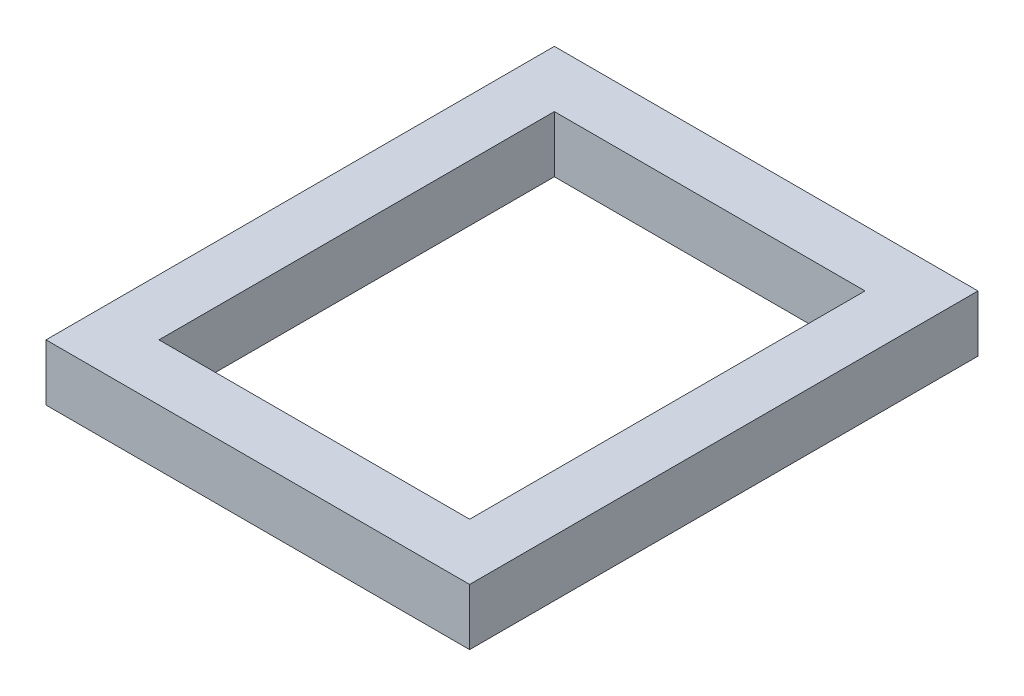
ISO-10303-21;
HEADER;
FILE_DESCRIPTION(('STEP AP214'),'2;1');
FILE_NAME('part.step','',(''),(''),'','','');
FILE_SCHEMA(('AUTOMOTIVE_DESIGN { 1 0 10303 214 1 1 1 1 }'));
ENDSEC;
DATA;
#1=APPLICATION_CONTEXT('core data for automotive mechanical design processes');
#2=APPLICATION_PROTOCOL_DEFINITION('international standard','automotive_design',2000,#1);
#3=PRODUCT_CONTEXT('',#1,'mechanical');
#4=PRODUCT('Part','Part','',(#3));
#5=PRODUCT_RELATED_PRODUCT_CATEGORY('part','',(#4));
#6=PRODUCT_DEFINITION_FORMATION('','',#4);
#7=PRODUCT_DEFINITION_CONTEXT('part definition',#1,'design');
#8=PRODUCT_DEFINITION('design','',#6,#7);
#9=PRODUCT_DEFINITION_SHAPE('','',#8);
#10=(LENGTH_UNIT() NAMED_UNIT(*) SI_UNIT(.MILLI.,.METRE.));
#11=(NAMED_UNIT(*) PLANE_ANGLE_UNIT() SI_UNIT($,.RADIAN.));
#12=(NAMED_UNIT(*) SI_UNIT($,.STERADIAN.) SOLID_ANGLE_UNIT());
#13=UNCERTAINTY_MEASURE_WITH_UNIT(LENGTH_MEASURE(1.E-05),#10,'distance_accuracy_value','');
#14=(GEOMETRIC_REPRESENTATION_CONTEXT(3) GLOBAL_UNCERTAINTY_ASSIGNED_CONTEXT((#13)) GLOBAL_UNIT_ASSIGNED_CONTEXT((#10,
#11,#12)) REPRESENTATION_CONTEXT('',''));
#15=CARTESIAN_POINT('',(0.,0.,0.));
#16=DIRECTION('',(0.,0.,1.));
#17=DIRECTION('',(1.,0.,0.));
#18=AXIS2_PLACEMENT_3D('',#15,#16,#17);
#19=CARTESIAN_POINT('',(0.,12.7,0.));
#20=DIRECTION('',(0.,-1.,0.));
#21=DIRECTION('',(0.,0.,-1.));
#22=AXIS2_PLACEMENT_3D('',#19,#20,#21);
#23=PLANE('',#22);
#24=DIRECTION('',(0.,0.,-1.));
#25=VECTOR('',#24,1.);
#26=CARTESIAN_POINT('',(47.625,12.7,57.15));
#27=LINE('',#26,#25);
#28=CARTESIAN_POINT('',(47.625,12.7,57.15));
#29=VERTEX_POINT('',#28);
#30=CARTESIAN_POINT('',(47.625,12.7,-57.15));
#31=VERTEX_POINT('',#30);
#32=EDGE_CURVE('E134',#29,#31,#27,.T.);
#33=ORIENTED_EDGE('',*,*,#32,.T.);
#34=DIRECTION('',(-1.,0.,0.));
#35=VECTOR('',#34,1.);
#36=CARTESIAN_POINT('',(-47.625,12.7,-57.15));
#37=LINE('',#36,#35);
#38=CARTESIAN_POINT('',(-47.625,12.7,-57.15));
#39=VERTEX_POINT('',#38);
#40=EDGE_CURVE('E137',#31,#39,#37,.T.);
#41=ORIENTED_EDGE('',*,*,#40,.T.);
#42=DIRECTION('',(0.,0.,1.));
#43=VECTOR('',#42,1.);
#44=CARTESIAN_POINT('',(-47.625,12.7,57.15));
#45=LINE('',#44,#43);
#46=CARTESIAN_POINT('',(-47.625,12.7,57.15));
#47=VERTEX_POINT('',#46);
#48=EDGE_CURVE('E140',#39,#47,#45,.T.);
#49=ORIENTED_EDGE('',*,*,#48,.T.);
#50=DIRECTION('',(1.,0.,0.));
#51=VECTOR('',#50,1.);
#52=CARTESIAN_POINT('',(-47.625,12.7,57.15));
#53=LINE('',#52,#51);
#54=EDGE_CURVE('E142',#47,#29,#53,.T.);
#55=ORIENTED_EDGE('',*,*,#54,.T.);
#56=EDGE_LOOP('',(#33,#41,#49,#55));
#57=FACE_BOUND('',#56,.T.);
#58=DIRECTION('',(0.,0.,-1.));
#59=VECTOR('',#58,1.);
#60=CARTESIAN_POINT('',(34.925,12.7,44.45));
#61=LINE('',#60,#59);
#62=CARTESIAN_POINT('',(34.925,12.7,44.45));
#63=VERTEX_POINT('',#62);
#64=CARTESIAN_POINT('',(34.925,12.7,-44.45));
#65=VERTEX_POINT('',#64);
#66=EDGE_CURVE('E98',#63,#65,#61,.T.);
#67=ORIENTED_EDGE('',*,*,#66,.F.);
#68=DIRECTION('',(1.,0.,0.));
#69=VECTOR('',#68,1.);
#70=CARTESIAN_POINT('',(-34.925,12.7,44.45));
#71=LINE('',#70,#69);
#72=CARTESIAN_POINT('',(-34.925,12.7,44.45));
#73=VERTEX_POINT('',#72);
#74=EDGE_CURVE('E120',#73,#63,#71,.T.);
#75=ORIENTED_EDGE('',*,*,#74,.F.);
#76=DIRECTION('',(0.,0.,1.));
#77=VECTOR('',#76,1.);
#78=CARTESIAN_POINT('',(-34.925,12.7,44.45));
#79=LINE('',#78,#77);
#80=CARTESIAN_POINT('',(-34.925,12.7,-44.45));
#81=VERTEX_POINT('',#80);
#82=EDGE_CURVE('E118',#81,#73,#79,.T.);
#83=ORIENTED_EDGE('',*,*,#82,.F.);
#84=DIRECTION('',(-1.,0.,0.));
#85=VECTOR('',#84,1.);
#86=CARTESIAN_POINT('',(-34.925,12.7,-44.45));
#87=LINE('',#86,#85);
#88=EDGE_CURVE('E106',#65,#81,#87,.T.);
#89=ORIENTED_EDGE('',*,*,#88,.F.);
#90=EDGE_LOOP('',(#67,#75,#83,#89));
#91=FACE_BOUND('',#90,.T.);
#92=ADVANCED_FACE('F33',(#57,#91),#23,.F.);
#93=CARTESIAN_POINT('',(0.,0.,0.));
#94=DIRECTION('',(0.,-1.,0.));
#95=DIRECTION('',(0.,0.,-1.));
#96=AXIS2_PLACEMENT_3D('',#93,#94,#95);
#97=PLANE('',#96);
#98=DIRECTION('',(0.,0.,-1.));
#99=VECTOR('',#98,1.);
#100=CARTESIAN_POINT('',(47.625,0.,57.15));
#101=LINE('',#100,#99);
#102=CARTESIAN_POINT('',(47.625,0.,57.15));
#103=VERTEX_POINT('',#102);
#104=CARTESIAN_POINT('',(47.625,0.,-57.15));
#105=VERTEX_POINT('',#104);
#106=EDGE_CURVE('E114',#103,#105,#101,.T.);
#107=ORIENTED_EDGE('',*,*,#106,.F.);
#108=DIRECTION('',(1.,0.,0.));
#109=VECTOR('',#108,1.);
#110=CARTESIAN_POINT('',(-47.625,0.,57.15));
#111=LINE('',#110,#109);
#112=CARTESIAN_POINT('',(-47.625,0.,57.15));
#113=VERTEX_POINT('',#112);
#114=EDGE_CURVE('E138',#113,#103,#111,.T.);
#115=ORIENTED_EDGE('',*,*,#114,.F.);
#116=DIRECTION('',(0.,0.,1.));
#117=VECTOR('',#116,1.);
#118=CARTESIAN_POINT('',(-47.625,0.,57.15));
#119=LINE('',#118,#117);
#120=CARTESIAN_POINT('',(-47.625,0.,-57.15));
#121=VERTEX_POINT('',#120);
#122=EDGE_CURVE('E149',#121,#113,#119,.T.);
#123=ORIENTED_EDGE('',*,*,#122,.F.);
#124=DIRECTION('',(-1.,0.,0.));
#125=VECTOR('',#124,1.);
#126=CARTESIAN_POINT('',(-47.625,0.,-57.15));
#127=LINE('',#126,#125);
#128=EDGE_CURVE('E147',#105,#121,#127,.T.);
#129=ORIENTED_EDGE('',*,*,#128,.F.);
#130=EDGE_LOOP('',(#107,#115,#123,#129));
#131=FACE_BOUND('',#130,.T.);
#132=DIRECTION('',(1.,0.,0.));
#133=VECTOR('',#132,1.);
#134=CARTESIAN_POINT('',(-34.925,0.,44.45));
#135=LINE('',#134,#133);
#136=CARTESIAN_POINT('',(-34.925,0.,44.45));
#137=VERTEX_POINT('',#136);
#138=CARTESIAN_POINT('',(34.925,0.,44.45));
#139=VERTEX_POINT('',#138);
#140=EDGE_CURVE('E107',#137,#139,#135,.T.);
#141=ORIENTED_EDGE('',*,*,#140,.T.);
#142=DIRECTION('',(0.,0.,-1.));
#143=VECTOR('',#142,1.);
#144=CARTESIAN_POINT('',(34.925,0.,44.45));
#145=LINE('',#144,#143);
#146=CARTESIAN_POINT('',(34.925,0.,-44.45));
#147=VERTEX_POINT('',#146);
#148=EDGE_CURVE('E56',#139,#147,#145,.T.);
#149=ORIENTED_EDGE('',*,*,#148,.T.);
#150=DIRECTION('',(-1.,0.,0.));
#151=VECTOR('',#150,1.);
#152=CARTESIAN_POINT('',(-34.925,0.,-44.45));
#153=LINE('',#152,#151);
#154=CARTESIAN_POINT('',(-34.925,0.,-44.45));
#155=VERTEX_POINT('',#154);
#156=EDGE_CURVE('E113',#147,#155,#153,.T.);
#157=ORIENTED_EDGE('',*,*,#156,.T.);
#158=DIRECTION('',(0.,0.,1.));
#159=VECTOR('',#158,1.);
#160=CARTESIAN_POINT('',(-34.925,0.,44.45));
#161=LINE('',#160,#159);
#162=EDGE_CURVE('E126',#155,#137,#161,.T.);
#163=ORIENTED_EDGE('',*,*,#162,.T.);
#164=EDGE_LOOP('',(#141,#149,#157,#163));
#165=FACE_BOUND('',#164,.T.);
#166=ADVANCED_FACE('F167',(#131,#165),#97,.T.);
#167=CARTESIAN_POINT('',(47.625,12.7,57.15));
#168=DIRECTION('',(-1.,0.,0.));
#169=DIRECTION('',(0.,0.,1.));
#170=AXIS2_PLACEMENT_3D('',#167,#168,#169);
#171=PLANE('',#170);
#172=ORIENTED_EDGE('',*,*,#106,.T.);
#173=DIRECTION('',(0.,-1.,0.));
#174=VECTOR('',#173,1.);
#175=CARTESIAN_POINT('',(47.625,12.7,-57.15));
#176=LINE('',#175,#174);
#177=EDGE_CURVE('E11',#31,#105,#176,.T.);
#178=ORIENTED_EDGE('',*,*,#177,.F.);
#179=ORIENTED_EDGE('',*,*,#32,.F.);
#180=DIRECTION('',(0.,-1.,0.));
#181=VECTOR('',#180,1.);
#182=CARTESIAN_POINT('',(47.625,12.7,57.15));
#183=LINE('',#182,#181);
#184=EDGE_CURVE('E144',#29,#103,#183,.T.);
#185=ORIENTED_EDGE('',*,*,#184,.T.);
#186=EDGE_LOOP('',(#172,#178,#179,#185));
#187=FACE_BOUND('',#186,.T.);
#188=ADVANCED_FACE('F35',(#187),#171,.F.);
#189=CARTESIAN_POINT('',(-47.625,12.7,-57.15));
#190=DIRECTION('',(0.,0.,1.));
#191=DIRECTION('',(1.,0.,0.));
#192=AXIS2_PLACEMENT_3D('',#189,#190,#191);
#193=PLANE('',#192);
#194=ORIENTED_EDGE('',*,*,#128,.T.);
#195=DIRECTION('',(0.,-1.,0.));
#196=VECTOR('',#195,1.);
#197=CARTESIAN_POINT('',(-47.625,12.7,-57.15));
#198=LINE('',#197,#196);
#199=EDGE_CURVE('E41',#39,#121,#198,.T.);
#200=ORIENTED_EDGE('',*,*,#199,.F.);
#201=ORIENTED_EDGE('',*,*,#40,.F.);
#202=ORIENTED_EDGE('',*,*,#177,.T.);
#203=EDGE_LOOP('',(#194,#200,#201,#202));
#204=FACE_BOUND('',#203,.T.);
#205=ADVANCED_FACE('F177',(#204),#193,.F.);
#206=CARTESIAN_POINT('',(-47.625,12.7,57.15));
#207=DIRECTION('',(1.,0.,0.));
#208=DIRECTION('',(0.,0.,-1.));
#209=AXIS2_PLACEMENT_3D('',#206,#207,#208);
#210=PLANE('',#209);
#211=ORIENTED_EDGE('',*,*,#122,.T.);
#212=DIRECTION('',(0.,-1.,0.));
#213=VECTOR('',#212,1.);
#214=CARTESIAN_POINT('',(-47.625,12.7,57.15));
#215=LINE('',#214,#213);
#216=EDGE_CURVE('E154',#47,#113,#215,.T.);
#217=ORIENTED_EDGE('',*,*,#216,.F.);
#218=ORIENTED_EDGE('',*,*,#48,.F.);
#219=ORIENTED_EDGE('',*,*,#199,.T.);
#220=EDGE_LOOP('',(#211,#217,#218,#219));
#221=FACE_BOUND('',#220,.T.);
#222=ADVANCED_FACE('F161',(#221),#210,.F.);
#223=CARTESIAN_POINT('',(-47.625,12.7,57.15));
#224=DIRECTION('',(0.,0.,-1.));
#225=DIRECTION('',(-1.,0.,0.));
#226=AXIS2_PLACEMENT_3D('',#223,#224,#225);
#227=PLANE('',#226);
#228=ORIENTED_EDGE('',*,*,#114,.T.);
#229=ORIENTED_EDGE('',*,*,#184,.F.);
#230=ORIENTED_EDGE('',*,*,#54,.F.);
#231=ORIENTED_EDGE('',*,*,#216,.T.);
#232=EDGE_LOOP('',(#228,#229,#230,#231));
#233=FACE_BOUND('',#232,.T.);
#234=ADVANCED_FACE('F171',(#233),#227,.F.);
#235=CARTESIAN_POINT('',(34.925,12.7,44.45));
#236=DIRECTION('',(-1.,0.,0.));
#237=DIRECTION('',(0.,0.,1.));
#238=AXIS2_PLACEMENT_3D('',#235,#236,#237);
#239=PLANE('',#238);
#240=ORIENTED_EDGE('',*,*,#148,.F.);
#241=DIRECTION('',(0.,-1.,0.));
#242=VECTOR('',#241,1.);
#243=CARTESIAN_POINT('',(34.925,12.7,44.45));
#244=LINE('',#243,#242);
#245=EDGE_CURVE('E102',#63,#139,#244,.T.);
#246=ORIENTED_EDGE('',*,*,#245,.F.);
#247=ORIENTED_EDGE('',*,*,#66,.T.);
#248=DIRECTION('',(0.,-1.,0.));
#249=VECTOR('',#248,1.);
#250=CARTESIAN_POINT('',(34.925,12.7,-44.45));
#251=LINE('',#250,#249);
#252=EDGE_CURVE('E101',#65,#147,#251,.T.);
#253=ORIENTED_EDGE('',*,*,#252,.T.);
#254=EDGE_LOOP('',(#240,#246,#247,#253));
#255=FACE_BOUND('',#254,.T.);
#256=ADVANCED_FACE('F100',(#255),#239,.T.);
#257=CARTESIAN_POINT('',(-34.925,12.7,-44.45));
#258=DIRECTION('',(0.,0.,1.));
#259=DIRECTION('',(1.,0.,0.));
#260=AXIS2_PLACEMENT_3D('',#257,#258,#259);
#261=PLANE('',#260);
#262=ORIENTED_EDGE('',*,*,#156,.F.);
#263=ORIENTED_EDGE('',*,*,#252,.F.);
#264=ORIENTED_EDGE('',*,*,#88,.T.);
#265=DIRECTION('',(0.,-1.,0.));
#266=VECTOR('',#265,1.);
#267=CARTESIAN_POINT('',(-34.925,12.7,-44.45));
#268=LINE('',#267,#266);
#269=EDGE_CURVE('E115',#81,#155,#268,.T.);
#270=ORIENTED_EDGE('',*,*,#269,.T.);
#271=EDGE_LOOP('',(#262,#263,#264,#270));
#272=FACE_BOUND('',#271,.T.);
#273=ADVANCED_FACE('F110',(#272),#261,.T.);
#274=CARTESIAN_POINT('',(-34.925,12.7,44.45));
#275=DIRECTION('',(1.,0.,0.));
#276=DIRECTION('',(0.,0.,-1.));
#277=AXIS2_PLACEMENT_3D('',#274,#275,#276);
#278=PLANE('',#277);
#279=ORIENTED_EDGE('',*,*,#162,.F.);
#280=ORIENTED_EDGE('',*,*,#269,.F.);
#281=ORIENTED_EDGE('',*,*,#82,.T.);
#282=DIRECTION('',(0.,-1.,0.));
#283=VECTOR('',#282,1.);
#284=CARTESIAN_POINT('',(-34.925,12.7,44.45));
#285=LINE('',#284,#283);
#286=EDGE_CURVE('E48',#73,#137,#285,.T.);
#287=ORIENTED_EDGE('',*,*,#286,.T.);
#288=EDGE_LOOP('',(#279,#280,#281,#287));
#289=FACE_BOUND('',#288,.T.);
#290=ADVANCED_FACE('F200',(#289),#278,.T.);
#291=CARTESIAN_POINT('',(-34.925,12.7,44.45));
#292=DIRECTION('',(0.,0.,-1.));
#293=DIRECTION('',(-1.,0.,0.));
#294=AXIS2_PLACEMENT_3D('',#291,#292,#293);
#295=PLANE('',#294);
#296=ORIENTED_EDGE('',*,*,#140,.F.);
#297=ORIENTED_EDGE('',*,*,#286,.F.);
#298=ORIENTED_EDGE('',*,*,#74,.T.);
#299=ORIENTED_EDGE('',*,*,#245,.T.);
#300=EDGE_LOOP('',(#296,#297,#298,#299));
#301=FACE_BOUND('',#300,.T.);
#302=ADVANCED_FACE('F204',(#301),#295,.T.);
#303=CLOSED_SHELL('',(#92,#166,#188,#205,#222,#234,#256,#273,#290,#302));
#304=MANIFOLD_SOLID_BREP('B2',#303);
#305=ADVANCED_BREP_SHAPE_REPRESENTATION('',(#18,#304),#14);
#306=SHAPE_DEFINITION_REPRESENTATION(#9,#305);
ENDSEC;
END-ISO-10303-21;
